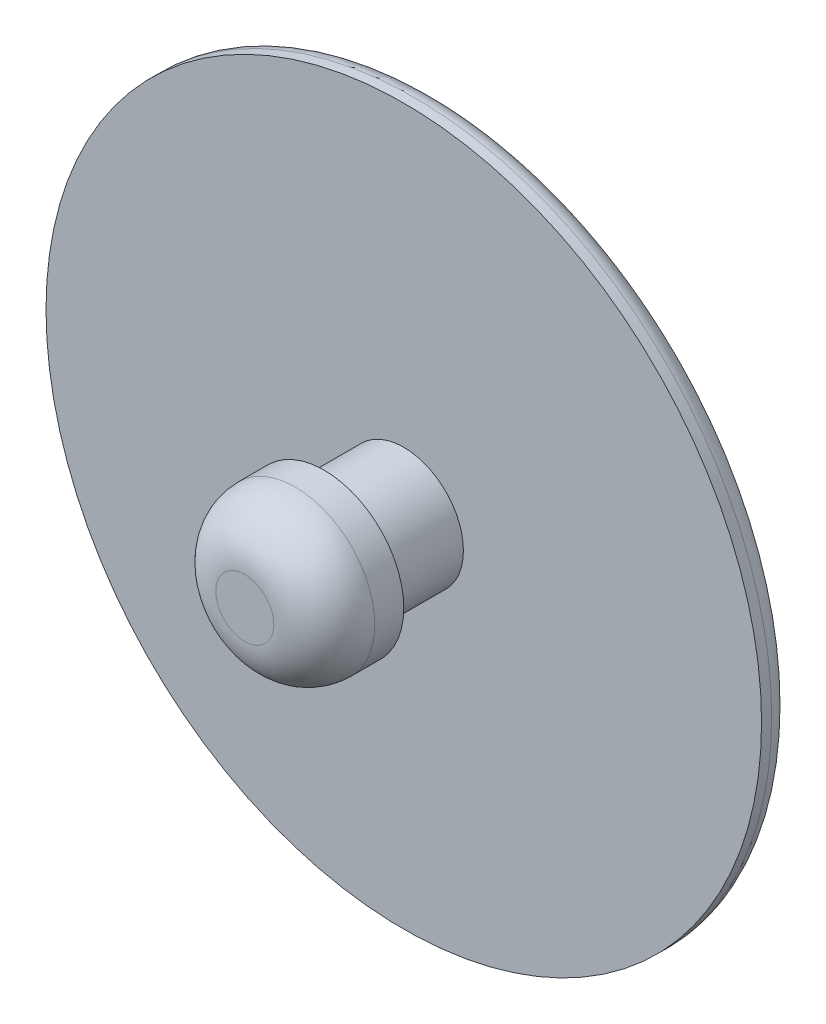
ISO-10303-21;
HEADER;
FILE_DESCRIPTION(('STEP AP214'),'2;1');
FILE_NAME('part.step','',(''),(''),'','','');
FILE_SCHEMA(('AUTOMOTIVE_DESIGN { 1 0 10303 214 1 1 1 1 }'));
ENDSEC;
DATA;
#1=APPLICATION_CONTEXT('core data for automotive mechanical design processes');
#2=APPLICATION_PROTOCOL_DEFINITION('international standard','automotive_design',2000,#1);
#3=PRODUCT_CONTEXT('',#1,'mechanical');
#4=PRODUCT('Part','Part','',(#3));
#5=PRODUCT_RELATED_PRODUCT_CATEGORY('part','',(#4));
#6=PRODUCT_DEFINITION_FORMATION('','',#4);
#7=PRODUCT_DEFINITION_CONTEXT('part definition',#1,'design');
#8=PRODUCT_DEFINITION('design','',#6,#7);
#9=PRODUCT_DEFINITION_SHAPE('','',#8);
#10=(LENGTH_UNIT() NAMED_UNIT(*) SI_UNIT(.MILLI.,.METRE.));
#11=(NAMED_UNIT(*) PLANE_ANGLE_UNIT() SI_UNIT($,.RADIAN.));
#12=(NAMED_UNIT(*) SI_UNIT($,.STERADIAN.) SOLID_ANGLE_UNIT());
#13=UNCERTAINTY_MEASURE_WITH_UNIT(LENGTH_MEASURE(1.E-05),#10,'distance_accuracy_value','');
#14=(GEOMETRIC_REPRESENTATION_CONTEXT(3) GLOBAL_UNCERTAINTY_ASSIGNED_CONTEXT((#13)) GLOBAL_UNIT_ASSIGNED_CONTEXT((#10,
#11,#12)) REPRESENTATION_CONTEXT('',''));
#15=CARTESIAN_POINT('',(0.,0.,0.));
#16=DIRECTION('',(0.,0.,1.));
#17=DIRECTION('',(1.,0.,0.));
#18=AXIS2_PLACEMENT_3D('',#15,#16,#17);
#19=CARTESIAN_POINT('',(0.,0.,0.762));
#20=DIRECTION('',(0.,0.,1.));
#21=DIRECTION('',(1.,0.,0.));
#22=AXIS2_PLACEMENT_3D('',#19,#20,#21);
#23=PLANE('',#22);
#24=CARTESIAN_POINT('',(0.,0.,0.762));
#25=DIRECTION('',(0.,0.,1.));
#26=DIRECTION('',(1.,0.,0.));
#27=AXIS2_PLACEMENT_3D('',#24,#25,#26);
#28=CIRCLE('',#27,9.);
#29=CARTESIAN_POINT('',(-9.,0.,0.762));
#30=VERTEX_POINT('',#29);
#31=EDGE_CURVE('E51',#30,#30,#28,.T.);
#32=ORIENTED_EDGE('',*,*,#31,.T.);
#33=EDGE_LOOP('',(#32));
#34=FACE_BOUND('',#33,.T.);
#35=CARTESIAN_POINT('',(0.,0.,0.762));
#36=DIRECTION('',(0.,0.,1.));
#37=DIRECTION('',(1.,0.,0.));
#38=AXIS2_PLACEMENT_3D('',#35,#36,#37);
#39=CIRCLE('',#38,1.5);
#40=CARTESIAN_POINT('',(1.5,0.,0.762));
#41=VERTEX_POINT('',#40);
#42=EDGE_CURVE('E55',#41,#41,#39,.T.);
#43=ORIENTED_EDGE('',*,*,#42,.F.);
#44=EDGE_LOOP('',(#43));
#45=FACE_BOUND('',#44,.T.);
#46=ADVANCED_FACE('F31',(#34,#45),#23,.T.);
#47=CARTESIAN_POINT('',(0.,0.,0.762));
#48=DIRECTION('',(0.,0.,-1.));
#49=DIRECTION('',(-1.,0.,0.));
#50=AXIS2_PLACEMENT_3D('',#47,#48,#49);
#51=CYLINDRICAL_SURFACE('',#50,9.);
#52=CARTESIAN_POINT('',(0.,0.,0.508));
#53=DIRECTION('',(0.,0.,1.));
#54=DIRECTION('',(1.,0.,0.));
#55=AXIS2_PLACEMENT_3D('',#52,#53,#54);
#56=CIRCLE('',#55,9.);
#57=CARTESIAN_POINT('',(-9.,0.,0.508));
#58=VERTEX_POINT('',#57);
#59=EDGE_CURVE('E46',#58,#58,#56,.T.);
#60=CARTESIAN_POINT('',(-9.,0.,0.508));
#61=CARTESIAN_POINT('',(-9.,0.,0.510645833333333));
#62=CARTESIAN_POINT('',(-9.,0.,0.513291666666667));
#63=CARTESIAN_POINT('',(-9.,0.,0.518583333333333));
#64=CARTESIAN_POINT('',(-9.,0.,0.521229166666667));
#65=CARTESIAN_POINT('',(-9.,0.,0.526520833333333));
#66=CARTESIAN_POINT('',(-9.,0.,0.529166666666667));
#67=CARTESIAN_POINT('',(-9.,0.,0.534458333333333));
#68=CARTESIAN_POINT('',(-9.,0.,0.537104166666666));
#69=CARTESIAN_POINT('',(-9.,0.,0.542395833333333));
#70=CARTESIAN_POINT('',(-9.,0.,0.545041666666667));
#71=CARTESIAN_POINT('',(-9.,0.,0.550333333333333));
#72=CARTESIAN_POINT('',(-9.,0.,0.552979166666667));
#73=CARTESIAN_POINT('',(-9.,0.,0.558270833333333));
#74=CARTESIAN_POINT('',(-9.,0.,0.560916666666667));
#75=CARTESIAN_POINT('',(-9.,0.,0.566208333333333));
#76=CARTESIAN_POINT('',(-9.,0.,0.568854166666667));
#77=CARTESIAN_POINT('',(-9.,0.,0.574145833333333));
#78=CARTESIAN_POINT('',(-9.,0.,0.576791666666666));
#79=CARTESIAN_POINT('',(-9.,0.,0.582083333333333));
#80=CARTESIAN_POINT('',(-9.,0.,0.584729166666667));
#81=CARTESIAN_POINT('',(-9.,0.,0.590020833333333));
#82=CARTESIAN_POINT('',(-9.,0.,0.592666666666667));
#83=CARTESIAN_POINT('',(-9.,0.,0.597958333333333));
#84=CARTESIAN_POINT('',(-9.,0.,0.600604166666667));
#85=CARTESIAN_POINT('',(-9.,0.,0.605895833333333));
#86=CARTESIAN_POINT('',(-9.,0.,0.608541666666667));
#87=CARTESIAN_POINT('',(-9.,0.,0.613833333333333));
#88=CARTESIAN_POINT('',(-9.,0.,0.616479166666667));
#89=CARTESIAN_POINT('',(-9.,0.,0.621770833333333));
#90=CARTESIAN_POINT('',(-9.,0.,0.624416666666667));
#91=CARTESIAN_POINT('',(-9.,0.,0.629708333333333));
#92=CARTESIAN_POINT('',(-9.,0.,0.632354166666667));
#93=CARTESIAN_POINT('',(-9.,0.,0.637645833333333));
#94=CARTESIAN_POINT('',(-9.,0.,0.640291666666667));
#95=CARTESIAN_POINT('',(-9.,0.,0.645583333333333));
#96=CARTESIAN_POINT('',(-9.,0.,0.648229166666667));
#97=CARTESIAN_POINT('',(-9.,0.,0.653520833333333));
#98=CARTESIAN_POINT('',(-9.,0.,0.656166666666667));
#99=CARTESIAN_POINT('',(-9.,0.,0.661458333333333));
#100=CARTESIAN_POINT('',(-9.,0.,0.664104166666667));
#101=CARTESIAN_POINT('',(-9.,0.,0.669395833333333));
#102=CARTESIAN_POINT('',(-9.,0.,0.672041666666667));
#103=CARTESIAN_POINT('',(-9.,0.,0.677333333333333));
#104=CARTESIAN_POINT('',(-9.,0.,0.679979166666667));
#105=CARTESIAN_POINT('',(-9.,0.,0.685270833333333));
#106=CARTESIAN_POINT('',(-9.,0.,0.687916666666667));
#107=CARTESIAN_POINT('',(-9.,0.,0.693208333333333));
#108=CARTESIAN_POINT('',(-9.,0.,0.695854166666667));
#109=CARTESIAN_POINT('',(-9.,0.,0.701145833333333));
#110=CARTESIAN_POINT('',(-9.,0.,0.703791666666667));
#111=CARTESIAN_POINT('',(-9.,0.,0.709083333333333));
#112=CARTESIAN_POINT('',(-9.,0.,0.711729166666667));
#113=CARTESIAN_POINT('',(-9.,0.,0.717020833333333));
#114=CARTESIAN_POINT('',(-9.,0.,0.719666666666667));
#115=CARTESIAN_POINT('',(-9.,0.,0.724958333333333));
#116=CARTESIAN_POINT('',(-9.,0.,0.727604166666666));
#117=CARTESIAN_POINT('',(-9.,0.,0.732895833333333));
#118=CARTESIAN_POINT('',(-9.,0.,0.735541666666667));
#119=CARTESIAN_POINT('',(-9.,0.,0.740833333333333));
#120=CARTESIAN_POINT('',(-9.,0.,0.743479166666667));
#121=CARTESIAN_POINT('',(-9.,0.,0.748770833333333));
#122=CARTESIAN_POINT('',(-9.,0.,0.751416666666667));
#123=CARTESIAN_POINT('',(-9.,0.,0.756708333333333));
#124=CARTESIAN_POINT('',(-9.,0.,0.759354166666667));
#125=CARTESIAN_POINT('',(-9.,0.,0.762));
#126=B_SPLINE_CURVE_WITH_KNOTS('',3,(#60,#61,#62,#63,#64,#65,#66,#67,#68,#69,#70,#71,#72,#73,
#74,#75,#76,#77,#78,#79,#80,#81,#82,#83,#84,#85,#86,#87,#88,#89,#90,#91,#92,#93,#94,#95,#96,#97,
#98,#99,#100,#101,#102,#103,#104,#105,#106,#107,#108,#109,#110,#111,#112,#113,#114,#115,#116,
#117,#118,#119,#120,#121,#122,#123,#124,#125),.UNSPECIFIED.,.F.,.F.,(4,2,2,2,2,2,2,2,2,2,2,2,2,
2,2,2,2,2,2,2,2,2,2,2,2,2,2,2,2,2,2,2,4),(0.,0.00793749999999992,0.0158749999999999,0.0238125,
0.0317499999999999,0.0396874999999999,0.0476249999999999,0.0555624999999999,0.0635,
0.0714374999999999,0.0793749999999999,0.0873124999999999,0.09525,0.1031875,0.111125,0.1190625,
0.127,0.1349375,0.142875,0.1508125,0.15875,0.1666875,0.174625,0.1825625,0.1905,0.1984375,
0.206375,0.2143125,0.22225,0.2301875,0.238125,0.2460625,0.254),.UNSPECIFIED.);
#127=EDGE_CURVE('BSEAM80',#58,#30,#126,.T.);
#128=ORIENTED_EDGE('',*,*,#59,.T.);
#129=ORIENTED_EDGE('',*,*,#31,.F.);
#130=ORIENTED_EDGE('',*,*,#127,.T.);
#131=ORIENTED_EDGE('',*,*,#127,.F.);
#132=EDGE_LOOP('',(#128,#130,#129,#131));
#133=FACE_BOUND('',#132,.T.);
#134=ADVANCED_FACE('F80',(#133),#51,.T.);
#135=CARTESIAN_POINT('',(0.,0.,0.));
#136=DIRECTION('',(0.,0.,1.));
#137=DIRECTION('',(1.,0.,0.));
#138=AXIS2_PLACEMENT_3D('',#135,#136,#137);
#139=PLANE('',#138);
#140=CARTESIAN_POINT('',(0.,0.,0.));
#141=DIRECTION('',(0.,0.,1.));
#142=DIRECTION('',(1.,0.,0.));
#143=AXIS2_PLACEMENT_3D('',#140,#141,#142);
#144=CIRCLE('',#143,8.492);
#145=CARTESIAN_POINT('',(8.492,0.,0.));
#146=VERTEX_POINT('',#145);
#147=EDGE_CURVE('E42',#146,#146,#144,.F.);
#148=ORIENTED_EDGE('',*,*,#147,.T.);
#149=EDGE_LOOP('',(#148));
#150=FACE_BOUND('',#149,.T.);
#151=ADVANCED_FACE('F86',(#150),#139,.F.);
#152=CARTESIAN_POINT('',(0.,0.,0.508));
#153=DIRECTION('',(0.,0.,1.));
#154=DIRECTION('',(1.,0.,0.));
#155=AXIS2_PLACEMENT_3D('',#152,#153,#154);
#156=TOROIDAL_SURFACE('',#155,8.492,0.508);
#157=ORIENTED_EDGE('',*,*,#147,.F.);
#158=EDGE_LOOP('',(#157));
#159=FACE_BOUND('',#158,.T.);
#160=ORIENTED_EDGE('',*,*,#59,.F.);
#161=EDGE_LOOP('',(#160));
#162=FACE_BOUND('',#161,.T.);
#163=ADVANCED_FACE('F75',(#159,#162),#156,.T.);
#164=CARTESIAN_POINT('',(0.,0.,2.762));
#165=DIRECTION('',(0.,0.,-1.));
#166=DIRECTION('',(-1.,0.,0.));
#167=AXIS2_PLACEMENT_3D('',#164,#165,#166);
#168=CYLINDRICAL_SURFACE('',#167,1.5);
#169=CARTESIAN_POINT('',(0.,0.,2.762));
#170=DIRECTION('',(0.,0.,1.));
#171=DIRECTION('',(1.,0.,0.));
#172=AXIS2_PLACEMENT_3D('',#169,#170,#171);
#173=CIRCLE('',#172,1.5);
#174=CARTESIAN_POINT('',(1.5,0.,2.762));
#175=VERTEX_POINT('',#174);
#176=EDGE_CURVE('E54',#175,#175,#173,.T.);
#177=ORIENTED_EDGE('',*,*,#176,.F.);
#178=EDGE_LOOP('',(#177));
#179=FACE_BOUND('',#178,.T.);
#180=ORIENTED_EDGE('',*,*,#42,.T.);
#181=EDGE_LOOP('',(#180));
#182=FACE_BOUND('',#181,.T.);
#183=ADVANCED_FACE('F69',(#179,#182),#168,.T.);
#184=CARTESIAN_POINT('',(0.,0.,2.762));
#185=DIRECTION('',(0.,0.,1.));
#186=DIRECTION('',(1.,0.,0.));
#187=AXIS2_PLACEMENT_3D('',#184,#185,#186);
#188=PLANE('',#187);
#189=CARTESIAN_POINT('',(0.,0.,2.762));
#190=DIRECTION('',(0.,0.,1.));
#191=DIRECTION('',(1.,0.,0.));
#192=AXIS2_PLACEMENT_3D('',#189,#190,#191);
#193=CIRCLE('',#192,2.);
#194=CARTESIAN_POINT('',(2.,0.,2.762));
#195=VERTEX_POINT('',#194);
#196=EDGE_CURVE('E58',#195,#195,#193,.T.);
#197=ORIENTED_EDGE('',*,*,#196,.F.);
#198=EDGE_LOOP('',(#197));
#199=FACE_BOUND('',#198,.T.);
#200=ORIENTED_EDGE('',*,*,#176,.T.);
#201=EDGE_LOOP('',(#200));
#202=FACE_BOUND('',#201,.T.);
#203=ADVANCED_FACE('F66',(#199,#202),#188,.F.);
#204=CARTESIAN_POINT('',(0.,0.,4.762));
#205=DIRECTION('',(0.,0.,-1.));
#206=DIRECTION('',(-1.,0.,0.));
#207=AXIS2_PLACEMENT_3D('',#204,#205,#206);
#208=CYLINDRICAL_SURFACE('',#207,2.);
#209=CARTESIAN_POINT('',(0.,0.,3.492));
#210=DIRECTION('',(0.,0.,1.));
#211=DIRECTION('',(1.,0.,0.));
#212=AXIS2_PLACEMENT_3D('',#209,#210,#211);
#213=CIRCLE('',#212,2.);
#214=CARTESIAN_POINT('',(2.,0.,3.492));
#215=VERTEX_POINT('',#214);
#216=EDGE_CURVE('E10',#215,#215,#213,.F.);
#217=ORIENTED_EDGE('',*,*,#216,.T.);
#218=EDGE_LOOP('',(#217));
#219=FACE_BOUND('',#218,.T.);
#220=ORIENTED_EDGE('',*,*,#196,.T.);
#221=EDGE_LOOP('',(#220));
#222=FACE_BOUND('',#221,.T.);
#223=ADVANCED_FACE('F64',(#219,#222),#208,.T.);
#224=CARTESIAN_POINT('',(0.,0.,4.762));
#225=DIRECTION('',(0.,0.,1.));
#226=DIRECTION('',(1.,0.,0.));
#227=AXIS2_PLACEMENT_3D('',#224,#225,#226);
#228=PLANE('',#227);
#229=CARTESIAN_POINT('',(0.,0.,4.762));
#230=DIRECTION('',(0.,0.,1.));
#231=DIRECTION('',(1.,0.,0.));
#232=AXIS2_PLACEMENT_3D('',#229,#230,#231);
#233=CIRCLE('',#232,0.73);
#234=CARTESIAN_POINT('',(0.73,0.,4.762));
#235=VERTEX_POINT('',#234);
#236=EDGE_CURVE('E38',#235,#235,#233,.T.);
#237=ORIENTED_EDGE('',*,*,#236,.T.);
#238=EDGE_LOOP('',(#237));
#239=FACE_BOUND('',#238,.T.);
#240=ADVANCED_FACE('F118',(#239),#228,.T.);
#241=CARTESIAN_POINT('',(0.,0.,3.492));
#242=DIRECTION('',(0.,0.,1.));
#243=DIRECTION('',(1.,0.,0.));
#244=AXIS2_PLACEMENT_3D('',#241,#242,#243);
#245=DEGENERATE_TOROIDAL_SURFACE('',#244,0.73,1.27,.T.);
#246=ORIENTED_EDGE('',*,*,#216,.F.);
#247=EDGE_LOOP('',(#246));
#248=FACE_BOUND('',#247,.T.);
#249=ORIENTED_EDGE('',*,*,#236,.F.);
#250=EDGE_LOOP('',(#249));
#251=FACE_BOUND('',#250,.T.);
#252=ADVANCED_FACE('F33',(#248,#251),#245,.T.);
#253=CLOSED_SHELL('',(#46,#134,#151,#163,#183,#203,#223,#240,#252));
#254=MANIFOLD_SOLID_BREP('B2',#253);
#255=ADVANCED_BREP_SHAPE_REPRESENTATION('',(#18,#254),#14);
#256=SHAPE_DEFINITION_REPRESENTATION(#9,#255);
ENDSEC;
END-ISO-10303-21;
